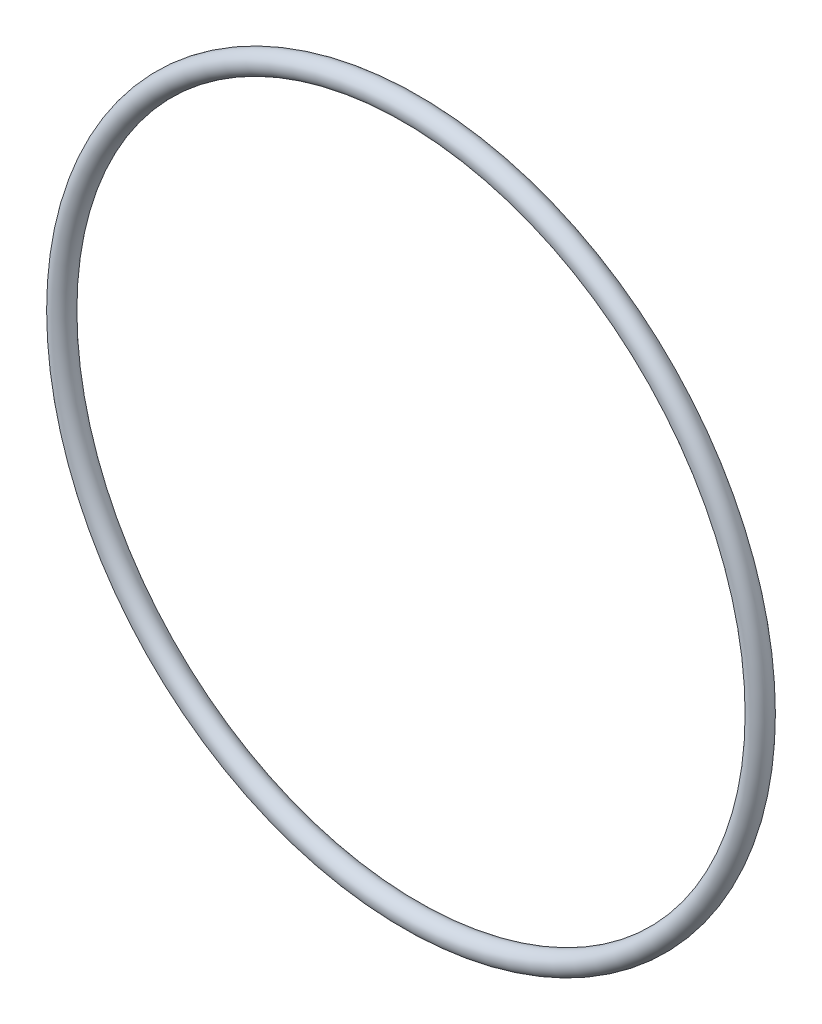
ISO-10303-21;
HEADER;
FILE_DESCRIPTION(('STEP AP214'),'2;1');
FILE_NAME('part.step','',(''),(''),'','','');
FILE_SCHEMA(('AUTOMOTIVE_DESIGN { 1 0 10303 214 1 1 1 1 }'));
ENDSEC;
DATA;
#1=APPLICATION_CONTEXT('core data for automotive mechanical design processes');
#2=APPLICATION_PROTOCOL_DEFINITION('international standard','automotive_design',2000,#1);
#3=PRODUCT_CONTEXT('',#1,'mechanical');
#4=PRODUCT('Part','Part','',(#3));
#5=PRODUCT_RELATED_PRODUCT_CATEGORY('part','',(#4));
#6=PRODUCT_DEFINITION_FORMATION('','',#4);
#7=PRODUCT_DEFINITION_CONTEXT('part definition',#1,'design');
#8=PRODUCT_DEFINITION('design','',#6,#7);
#9=PRODUCT_DEFINITION_SHAPE('','',#8);
#10=(LENGTH_UNIT() NAMED_UNIT(*) SI_UNIT(.MILLI.,.METRE.));
#11=(NAMED_UNIT(*) PLANE_ANGLE_UNIT() SI_UNIT($,.RADIAN.));
#12=(NAMED_UNIT(*) SI_UNIT($,.STERADIAN.) SOLID_ANGLE_UNIT());
#13=UNCERTAINTY_MEASURE_WITH_UNIT(LENGTH_MEASURE(1.E-05),#10,'distance_accuracy_value','');
#14=(GEOMETRIC_REPRESENTATION_CONTEXT(3) GLOBAL_UNCERTAINTY_ASSIGNED_CONTEXT((#13)) GLOBAL_UNIT_ASSIGNED_CONTEXT((#10,
#11,#12)) REPRESENTATION_CONTEXT('',''));
#15=CARTESIAN_POINT('',(0.,0.,0.));
#16=DIRECTION('',(0.,0.,1.));
#17=DIRECTION('',(1.,0.,0.));
#18=AXIS2_PLACEMENT_3D('',#15,#16,#17);
#19=CARTESIAN_POINT('',(0.,0.,0.));
#20=DIRECTION('',(0.,0.,1.));
#21=DIRECTION('',(1.,0.,0.));
#22=AXIS2_PLACEMENT_3D('',#19,#20,#21);
#23=TOROIDAL_SURFACE('',#22,81.5,2.49999999999999);
#24=CARTESIAN_POINT('',(-81.5,0.,0.));
#25=DIRECTION('',(0.,1.,0.));
#26=DIRECTION('',(0.,0.,1.));
#27=AXIS2_PLACEMENT_3D('',#24,#25,#26);
#28=CIRCLE('',#27,2.49999999999999);
#29=CARTESIAN_POINT('',(-84.,0.,0.));
#30=VERTEX_POINT('',#29);
#31=EDGE_CURVE('E10',#30,#30,#28,.T.);
#32=CARTESIAN_POINT('',(0.,0.,0.));
#33=DIRECTION('',(0.,0.,1.));
#34=DIRECTION('',(1.,0.,0.));
#35=AXIS2_PLACEMENT_3D('',#32,#33,#34);
#36=CIRCLE('',#35,84.);
#37=EDGE_CURVE('',#30,#30,#36,.T.);
#38=ORIENTED_EDGE('',*,*,#31,.F.);
#39=ORIENTED_EDGE('',*,*,#31,.T.);
#40=ORIENTED_EDGE('',*,*,#37,.T.);
#41=ORIENTED_EDGE('',*,*,#37,.F.);
#42=EDGE_LOOP('',(#38,#40,#39,#41));
#43=FACE_BOUND('',#42,.T.);
#44=ADVANCED_FACE('F37',(#43),#23,.T.);
#45=CLOSED_SHELL('',(#44));
#46=MANIFOLD_SOLID_BREP('B2',#45);
#47=ADVANCED_BREP_SHAPE_REPRESENTATION('',(#18,#46),#14);
#48=SHAPE_DEFINITION_REPRESENTATION(#9,#47);
ENDSEC;
END-ISO-10303-21;
